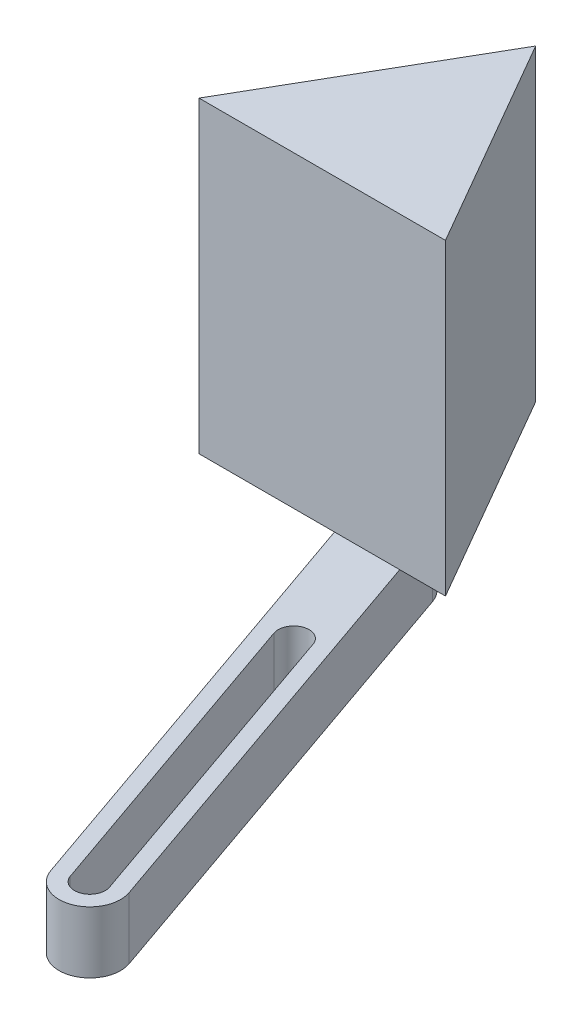
ISO-10303-21;
HEADER;
FILE_DESCRIPTION(('STEP AP214'),'2;1');
FILE_NAME('part.step','',(''),(''),'','','');
FILE_SCHEMA(('AUTOMOTIVE_DESIGN { 1 0 10303 214 1 1 1 1 }'));
ENDSEC;
DATA;
#1=APPLICATION_CONTEXT('core data for automotive mechanical design processes');
#2=APPLICATION_PROTOCOL_DEFINITION('international standard','automotive_design',2000,#1);
#3=PRODUCT_CONTEXT('',#1,'mechanical');
#4=PRODUCT('Part','Part','',(#3));
#5=PRODUCT_RELATED_PRODUCT_CATEGORY('part','',(#4));
#6=PRODUCT_DEFINITION_FORMATION('','',#4);
#7=PRODUCT_DEFINITION_CONTEXT('part definition',#1,'design');
#8=PRODUCT_DEFINITION('design','',#6,#7);
#9=PRODUCT_DEFINITION_SHAPE('','',#8);
#10=(LENGTH_UNIT() NAMED_UNIT(*) SI_UNIT(.MILLI.,.METRE.));
#11=(NAMED_UNIT(*) PLANE_ANGLE_UNIT() SI_UNIT($,.RADIAN.));
#12=(NAMED_UNIT(*) SI_UNIT($,.STERADIAN.) SOLID_ANGLE_UNIT());
#13=UNCERTAINTY_MEASURE_WITH_UNIT(LENGTH_MEASURE(1.E-05),#10,'distance_accuracy_value','');
#14=(GEOMETRIC_REPRESENTATION_CONTEXT(3) GLOBAL_UNCERTAINTY_ASSIGNED_CONTEXT((#13)) GLOBAL_UNIT_ASSIGNED_CONTEXT((#10,
#11,#12)) REPRESENTATION_CONTEXT('',''));
#15=CARTESIAN_POINT('',(0.,0.,0.));
#16=DIRECTION('',(0.,0.,1.));
#17=DIRECTION('',(1.,0.,0.));
#18=AXIS2_PLACEMENT_3D('',#15,#16,#17);
#19=CARTESIAN_POINT('',(-300.,0.,519.615242270663));
#20=DIRECTION('',(0.,-1.,0.));
#21=DIRECTION('',(0.,0.,-1.));
#22=AXIS2_PLACEMENT_3D('',#19,#20,#21);
#23=CYLINDRICAL_SURFACE('',#22,4.99999999999997);
#24=CARTESIAN_POINT('',(-300.,-10.,519.615242270663));
#25=DIRECTION('',(0.,1.,0.));
#26=DIRECTION('',(0.,0.,1.));
#27=AXIS2_PLACEMENT_3D('',#24,#25,#26);
#28=CIRCLE('',#27,4.99999999999997);
#29=CARTESIAN_POINT('',(-304.722308626151,-10.,521.258349461136));
#30=VERTEX_POINT('',#29);
#31=CARTESIAN_POINT('',(-295.277691373849,-10.,517.97213508019));
#32=VERTEX_POINT('',#31);
#33=EDGE_CURVE('E152',#30,#32,#28,.F.);
#34=ORIENTED_EDGE('',*,*,#33,.F.);
#35=DIRECTION('',(0.,-1.,0.));
#36=VECTOR('',#35,1.);
#37=CARTESIAN_POINT('',(-304.722308626151,0.,521.258349461136));
#38=LINE('',#37,#36);
#39=CARTESIAN_POINT('',(-304.722308626151,0.,521.258349461136));
#40=VERTEX_POINT('',#39);
#41=EDGE_CURVE('E11',#40,#30,#38,.T.);
#42=ORIENTED_EDGE('',*,*,#41,.F.);
#43=CARTESIAN_POINT('',(-300.,0.,519.615242270663));
#44=DIRECTION('',(0.,1.,0.));
#45=DIRECTION('',(0.,0.,1.));
#46=AXIS2_PLACEMENT_3D('',#43,#44,#45);
#47=CIRCLE('',#46,4.99999999999997);
#48=CARTESIAN_POINT('',(-295.277691373849,0.,517.97213508019));
#49=VERTEX_POINT('',#48);
#50=EDGE_CURVE('E170',#40,#49,#47,.F.);
#51=ORIENTED_EDGE('',*,*,#50,.T.);
#52=DIRECTION('',(0.,-1.,0.));
#53=VECTOR('',#52,1.);
#54=CARTESIAN_POINT('',(-295.277691373849,0.,517.97213508019));
#55=LINE('',#54,#53);
#56=EDGE_CURVE('E47',#49,#32,#55,.T.);
#57=ORIENTED_EDGE('',*,*,#56,.T.);
#58=EDGE_LOOP('',(#34,#42,#51,#57));
#59=FACE_BOUND('',#58,.T.);
#60=ADVANCED_FACE('F37',(#59),#23,.T.);
#61=CARTESIAN_POINT('',(0.,-10.,0.));
#62=DIRECTION('',(0.,1.,0.));
#63=DIRECTION('',(0.,0.,1.));
#64=AXIS2_PLACEMENT_3D('',#61,#62,#63);
#65=PLANE('',#64);
#66=ORIENTED_EDGE('',*,*,#33,.T.);
#67=DIRECTION('',(0.328621438094535,0.,0.944461725230133));
#68=VECTOR('',#67,1.);
#69=CARTESIAN_POINT('',(-424.15325169489,-10.,147.582318924024));
#70=LINE('',#69,#68);
#71=CARTESIAN_POINT('',(-268.987976326287,-10.,593.529073098601));
#72=VERTEX_POINT('',#71);
#73=EDGE_CURVE('E163',#32,#72,#70,.T.);
#74=ORIENTED_EDGE('',*,*,#73,.T.);
#75=CARTESIAN_POINT('',(-273.710284952437,-10.,595.172180289074));
#76=DIRECTION('',(0.,1.,0.));
#77=DIRECTION('',(0.,0.,1.));
#78=AXIS2_PLACEMENT_3D('',#75,#76,#77);
#79=CIRCLE('',#78,5.00000000000002);
#80=CARTESIAN_POINT('',(-278.432593578588,-10.,596.815287479546));
#81=VERTEX_POINT('',#80);
#82=EDGE_CURVE('E143',#81,#72,#79,.T.);
#83=ORIENTED_EDGE('',*,*,#82,.F.);
#84=DIRECTION('',(0.328621438094535,0.,0.944461725230133));
#85=VECTOR('',#84,1.);
#86=CARTESIAN_POINT('',(-433.597868947191,-10.,150.86853330497));
#87=LINE('',#86,#85);
#88=EDGE_CURVE('E158',#30,#81,#87,.T.);
#89=ORIENTED_EDGE('',*,*,#88,.F.);
#90=EDGE_LOOP('',(#66,#74,#83,#89));
#91=FACE_BOUND('',#90,.T.);
#92=DIRECTION('',(0.328621438094534,0.,0.944461725230134));
#93=VECTOR('',#92,1.);
#94=CARTESIAN_POINT('',(-431.236714634115,-10.,150.046979709733));
#95=LINE('',#94,#93);
#96=CARTESIAN_POINT('',(-293.72179034705,-10.,545.266425495529));
#97=VERTEX_POINT('',#96);
#98=CARTESIAN_POINT('',(-276.071439265513,-10.,595.99373388431));
#99=VERTEX_POINT('',#98);
#100=EDGE_CURVE('E98',#97,#99,#95,.T.);
#101=ORIENTED_EDGE('',*,*,#100,.T.);
#102=CARTESIAN_POINT('',(-273.710284952437,-10.,595.172180289074));
#103=DIRECTION('',(0.,1.,0.));
#104=DIRECTION('',(0.,0.,1.));
#105=AXIS2_PLACEMENT_3D('',#102,#103,#104);
#106=CIRCLE('',#105,2.50000000000002);
#107=CARTESIAN_POINT('',(-271.349130639362,-10.,594.350626693838));
#108=VERTEX_POINT('',#107);
#109=EDGE_CURVE('E133',#108,#99,#106,.F.);
#110=ORIENTED_EDGE('',*,*,#109,.F.);
#111=DIRECTION('',(0.328621438094534,0.,0.944461725230134));
#112=VECTOR('',#111,1.);
#113=CARTESIAN_POINT('',(-426.514406007964,-10.,148.40387251926));
#114=LINE('',#113,#112);
#115=CARTESIAN_POINT('',(-288.999481720899,-10.,543.623318305056));
#116=VERTEX_POINT('',#115);
#117=EDGE_CURVE('E137',#116,#108,#114,.T.);
#118=ORIENTED_EDGE('',*,*,#117,.F.);
#119=CARTESIAN_POINT('',(-291.360636033974,-10.,544.444871900293));
#120=DIRECTION('',(0.,1.,0.));
#121=DIRECTION('',(0.,0.,1.));
#122=AXIS2_PLACEMENT_3D('',#119,#120,#121);
#123=CIRCLE('',#122,2.49999999999997);
#124=EDGE_CURVE('E122',#97,#116,#123,.F.);
#125=ORIENTED_EDGE('',*,*,#124,.F.);
#126=EDGE_LOOP('',(#101,#110,#118,#125));
#127=FACE_BOUND('',#126,.T.);
#128=ADVANCED_FACE('F178',(#91,#127),#65,.F.);
#129=CARTESIAN_POINT('',(-424.15325169489,0.,147.582318924024));
#130=DIRECTION('',(0.944461725230133,0.,-0.328621438094535));
#131=DIRECTION('',(-0.328621438094535,0.,-0.944461725230133));
#132=AXIS2_PLACEMENT_3D('',#129,#130,#131);
#133=PLANE('',#132);
#134=ORIENTED_EDGE('',*,*,#73,.F.);
#135=ORIENTED_EDGE('',*,*,#56,.F.);
#136=DIRECTION('',(0.328621438094535,0.,0.944461725230133));
#137=VECTOR('',#136,1.);
#138=CARTESIAN_POINT('',(-424.15325169489,0.,147.582318924024));
#139=LINE('',#138,#137);
#140=CARTESIAN_POINT('',(-268.987976326287,0.,593.529073098601));
#141=VERTEX_POINT('',#140);
#142=EDGE_CURVE('E166',#49,#141,#139,.T.);
#143=ORIENTED_EDGE('',*,*,#142,.T.);
#144=DIRECTION('',(0.,-1.,0.));
#145=VECTOR('',#144,1.);
#146=CARTESIAN_POINT('',(-268.987976326287,0.,593.529073098601));
#147=LINE('',#146,#145);
#148=EDGE_CURVE('E147',#141,#72,#147,.T.);
#149=ORIENTED_EDGE('',*,*,#148,.T.);
#150=EDGE_LOOP('',(#134,#135,#143,#149));
#151=FACE_BOUND('',#150,.T.);
#152=ADVANCED_FACE('F180',(#151),#133,.T.);
#153=CARTESIAN_POINT('',(-433.597868947191,0.,150.86853330497));
#154=DIRECTION('',(0.944461725230133,0.,-0.328621438094535));
#155=DIRECTION('',(-0.328621438094535,0.,-0.944461725230133));
#156=AXIS2_PLACEMENT_3D('',#153,#154,#155);
#157=PLANE('',#156);
#158=ORIENTED_EDGE('',*,*,#88,.T.);
#159=DIRECTION('',(0.,-1.,0.));
#160=VECTOR('',#159,1.);
#161=CARTESIAN_POINT('',(-278.432593578588,0.,596.815287479546));
#162=LINE('',#161,#160);
#163=CARTESIAN_POINT('',(-278.432593578588,0.,596.815287479546));
#164=VERTEX_POINT('',#163);
#165=EDGE_CURVE('E41',#164,#81,#162,.T.);
#166=ORIENTED_EDGE('',*,*,#165,.F.);
#167=DIRECTION('',(0.328621438094535,0.,0.944461725230133));
#168=VECTOR('',#167,1.);
#169=CARTESIAN_POINT('',(-433.597868947191,0.,150.86853330497));
#170=LINE('',#169,#168);
#171=EDGE_CURVE('E215',#40,#164,#170,.T.);
#172=ORIENTED_EDGE('',*,*,#171,.F.);
#173=ORIENTED_EDGE('',*,*,#41,.T.);
#174=EDGE_LOOP('',(#158,#166,#172,#173));
#175=FACE_BOUND('',#174,.T.);
#176=ADVANCED_FACE('F186',(#175),#157,.F.);
#177=CARTESIAN_POINT('',(0.,0.,0.));
#178=DIRECTION('',(0.,1.,0.));
#179=DIRECTION('',(0.,0.,1.));
#180=AXIS2_PLACEMENT_3D('',#177,#178,#179);
#181=PLANE('',#180);
#182=CARTESIAN_POINT('',(-300.,0.,519.615242270663));
#183=DIRECTION('',(0.,1.,0.));
#184=DIRECTION('',(0.,0.,1.));
#185=AXIS2_PLACEMENT_3D('',#182,#183,#184);
#186=CIRCLE('',#185,2.50000000000002);
#187=CARTESIAN_POINT('',(-300.,0.,522.115242270663));
#188=VERTEX_POINT('',#187);
#189=EDGE_CURVE('E218',#188,#188,#186,.T.);
#190=ORIENTED_EDGE('',*,*,#189,.F.);
#191=EDGE_LOOP('',(#190));
#192=FACE_BOUND('',#191,.T.);
#193=ORIENTED_EDGE('',*,*,#50,.F.);
#194=ORIENTED_EDGE('',*,*,#171,.T.);
#195=CARTESIAN_POINT('',(-273.710284952437,0.,595.172180289074));
#196=DIRECTION('',(0.,1.,0.));
#197=DIRECTION('',(0.,0.,1.));
#198=AXIS2_PLACEMENT_3D('',#195,#196,#197);
#199=CIRCLE('',#198,5.00000000000002);
#200=EDGE_CURVE('E144',#164,#141,#199,.T.);
#201=ORIENTED_EDGE('',*,*,#200,.T.);
#202=ORIENTED_EDGE('',*,*,#142,.F.);
#203=EDGE_LOOP('',(#193,#194,#201,#202));
#204=FACE_BOUND('',#203,.T.);
#205=CARTESIAN_POINT('',(-273.710284952437,0.,595.172180289074));
#206=DIRECTION('',(0.,1.,0.));
#207=DIRECTION('',(0.,0.,1.));
#208=AXIS2_PLACEMENT_3D('',#205,#206,#207);
#209=CIRCLE('',#208,2.50000000000002);
#210=CARTESIAN_POINT('',(-271.349130639362,0.,594.350626693838));
#211=VERTEX_POINT('',#210);
#212=CARTESIAN_POINT('',(-276.071439265513,0.,595.99373388431));
#213=VERTEX_POINT('',#212);
#214=EDGE_CURVE('E115',#211,#213,#209,.F.);
#215=ORIENTED_EDGE('',*,*,#214,.T.);
#216=DIRECTION('',(0.328621438094534,0.,0.944461725230134));
#217=VECTOR('',#216,1.);
#218=CARTESIAN_POINT('',(-431.236714634115,0.,150.046979709733));
#219=LINE('',#218,#217);
#220=CARTESIAN_POINT('',(-293.72179034705,0.,545.266425495529));
#221=VERTEX_POINT('',#220);
#222=EDGE_CURVE('E127',#221,#213,#219,.T.);
#223=ORIENTED_EDGE('',*,*,#222,.F.);
#224=CARTESIAN_POINT('',(-291.360636033974,0.,544.444871900293));
#225=DIRECTION('',(0.,1.,0.));
#226=DIRECTION('',(0.,0.,1.));
#227=AXIS2_PLACEMENT_3D('',#224,#225,#226);
#228=CIRCLE('',#227,2.49999999999997);
#229=CARTESIAN_POINT('',(-288.999481720899,0.,543.623318305056));
#230=VERTEX_POINT('',#229);
#231=EDGE_CURVE('E114',#221,#230,#228,.F.);
#232=ORIENTED_EDGE('',*,*,#231,.T.);
#233=DIRECTION('',(0.328621438094534,0.,0.944461725230134));
#234=VECTOR('',#233,1.);
#235=CARTESIAN_POINT('',(-426.514406007964,0.,148.40387251926));
#236=LINE('',#235,#234);
#237=EDGE_CURVE('E103',#230,#211,#236,.T.);
#238=ORIENTED_EDGE('',*,*,#237,.T.);
#239=EDGE_LOOP('',(#215,#223,#232,#238));
#240=FACE_BOUND('',#239,.T.);
#241=ADVANCED_FACE('F126',(#192,#204,#240),#181,.T.);
#242=CARTESIAN_POINT('',(-291.360636033974,0.,544.444871900293));
#243=DIRECTION('',(0.,-1.,0.));
#244=DIRECTION('',(0.,0.,-1.));
#245=AXIS2_PLACEMENT_3D('',#242,#243,#244);
#246=CYLINDRICAL_SURFACE('',#245,2.49999999999997);
#247=ORIENTED_EDGE('',*,*,#124,.T.);
#248=DIRECTION('',(0.,-1.,0.));
#249=VECTOR('',#248,1.);
#250=CARTESIAN_POINT('',(-288.999481720899,0.,543.623318305056));
#251=LINE('',#250,#249);
#252=EDGE_CURVE('E107',#230,#116,#251,.T.);
#253=ORIENTED_EDGE('',*,*,#252,.F.);
#254=ORIENTED_EDGE('',*,*,#231,.F.);
#255=DIRECTION('',(0.,-1.,0.));
#256=VECTOR('',#255,1.);
#257=CARTESIAN_POINT('',(-293.72179034705,0.,545.266425495529));
#258=LINE('',#257,#256);
#259=EDGE_CURVE('E124',#221,#97,#258,.T.);
#260=ORIENTED_EDGE('',*,*,#259,.T.);
#261=EDGE_LOOP('',(#247,#253,#254,#260));
#262=FACE_BOUND('',#261,.T.);
#263=ADVANCED_FACE('F119',(#262),#246,.F.);
#264=CARTESIAN_POINT('',(-426.514406007964,0.,148.40387251926));
#265=DIRECTION('',(0.944461725230134,0.,-0.328621438094534));
#266=DIRECTION('',(-0.328621438094534,0.,-0.944461725230134));
#267=AXIS2_PLACEMENT_3D('',#264,#265,#266);
#268=PLANE('',#267);
#269=ORIENTED_EDGE('',*,*,#117,.T.);
#270=DIRECTION('',(0.,-1.,0.));
#271=VECTOR('',#270,1.);
#272=CARTESIAN_POINT('',(-271.349130639362,0.,594.350626693838));
#273=LINE('',#272,#271);
#274=EDGE_CURVE('E109',#211,#108,#273,.T.);
#275=ORIENTED_EDGE('',*,*,#274,.F.);
#276=ORIENTED_EDGE('',*,*,#237,.F.);
#277=ORIENTED_EDGE('',*,*,#252,.T.);
#278=EDGE_LOOP('',(#269,#275,#276,#277));
#279=FACE_BOUND('',#278,.T.);
#280=ADVANCED_FACE('F106',(#279),#268,.F.);
#281=CARTESIAN_POINT('',(-273.710284952437,0.,595.172180289074));
#282=DIRECTION('',(0.,-1.,0.));
#283=DIRECTION('',(0.,0.,-1.));
#284=AXIS2_PLACEMENT_3D('',#281,#282,#283);
#285=CYLINDRICAL_SURFACE('',#284,2.50000000000002);
#286=ORIENTED_EDGE('',*,*,#109,.T.);
#287=DIRECTION('',(0.,-1.,0.));
#288=VECTOR('',#287,1.);
#289=CARTESIAN_POINT('',(-276.071439265513,0.,595.99373388431));
#290=LINE('',#289,#288);
#291=EDGE_CURVE('E141',#213,#99,#290,.T.);
#292=ORIENTED_EDGE('',*,*,#291,.F.);
#293=ORIENTED_EDGE('',*,*,#214,.F.);
#294=ORIENTED_EDGE('',*,*,#274,.T.);
#295=EDGE_LOOP('',(#286,#292,#293,#294));
#296=FACE_BOUND('',#295,.T.);
#297=ADVANCED_FACE('F174',(#296),#285,.F.);
#298=CARTESIAN_POINT('',(-431.236714634115,0.,150.046979709733));
#299=DIRECTION('',(0.944461725230134,0.,-0.328621438094534));
#300=DIRECTION('',(-0.328621438094534,0.,-0.944461725230134));
#301=AXIS2_PLACEMENT_3D('',#298,#299,#300);
#302=PLANE('',#301);
#303=ORIENTED_EDGE('',*,*,#100,.F.);
#304=ORIENTED_EDGE('',*,*,#259,.F.);
#305=ORIENTED_EDGE('',*,*,#222,.T.);
#306=ORIENTED_EDGE('',*,*,#291,.T.);
#307=EDGE_LOOP('',(#303,#304,#305,#306));
#308=FACE_BOUND('',#307,.T.);
#309=ADVANCED_FACE('F176',(#308),#302,.T.);
#310=CARTESIAN_POINT('',(-273.710284952437,0.,595.172180289074));
#311=DIRECTION('',(0.,-1.,0.));
#312=DIRECTION('',(0.,0.,-1.));
#313=AXIS2_PLACEMENT_3D('',#310,#311,#312);
#314=CYLINDRICAL_SURFACE('',#313,5.00000000000002);
#315=ORIENTED_EDGE('',*,*,#82,.T.);
#316=ORIENTED_EDGE('',*,*,#148,.F.);
#317=ORIENTED_EDGE('',*,*,#200,.F.);
#318=ORIENTED_EDGE('',*,*,#165,.T.);
#319=EDGE_LOOP('',(#315,#316,#317,#318));
#320=FACE_BOUND('',#319,.T.);
#321=ADVANCED_FACE('F39',(#320),#314,.T.);
#322=CARTESIAN_POINT('',(-300.,5.,519.615242270663));
#323=DIRECTION('',(0.,-1.,0.));
#324=DIRECTION('',(0.,0.,-1.));
#325=AXIS2_PLACEMENT_3D('',#322,#323,#324);
#326=CYLINDRICAL_SURFACE('',#325,2.50000000000002);
#327=CARTESIAN_POINT('',(-300.,5.,519.615242270663));
#328=DIRECTION('',(0.,1.,0.));
#329=DIRECTION('',(0.,0.,1.));
#330=AXIS2_PLACEMENT_3D('',#327,#328,#329);
#331=CIRCLE('',#330,2.50000000000002);
#332=CARTESIAN_POINT('',(-300.,5.,522.115242270663));
#333=VERTEX_POINT('',#332);
#334=EDGE_CURVE('E134',#333,#333,#331,.T.);
#335=ORIENTED_EDGE('',*,*,#334,.F.);
#336=EDGE_LOOP('',(#335));
#337=FACE_BOUND('',#336,.T.);
#338=ORIENTED_EDGE('',*,*,#189,.T.);
#339=EDGE_LOOP('',(#338));
#340=FACE_BOUND('',#339,.T.);
#341=ADVANCED_FACE('F205',(#337,#340),#326,.T.);
#342=CARTESIAN_POINT('',(-310.,55.,513.841739578767));
#343=DIRECTION('',(-0.866025403784439,0.,-0.499999999999999));
#344=DIRECTION('',(-0.499999999999999,0.,0.866025403784439));
#345=AXIS2_PLACEMENT_3D('',#342,#343,#344);
#346=PLANE('',#345);
#347=DIRECTION('',(0.499999999999999,0.,-0.866025403784439));
#348=VECTOR('',#347,1.);
#349=CARTESIAN_POINT('',(-310.,5.,513.841739578767));
#350=LINE('',#349,#348);
#351=CARTESIAN_POINT('',(-320.,5.,531.162247654456));
#352=VERTEX_POINT('',#351);
#353=CARTESIAN_POINT('',(-300.,5.,496.521231503078));
#354=VERTEX_POINT('',#353);
#355=EDGE_CURVE('E240',#352,#354,#350,.T.);
#356=ORIENTED_EDGE('',*,*,#355,.F.);
#357=DIRECTION('',(0.,-1.,0.));
#358=VECTOR('',#357,1.);
#359=CARTESIAN_POINT('',(-320.,55.,531.162247654456));
#360=LINE('',#359,#358);
#361=CARTESIAN_POINT('',(-320.,55.,531.162247654456));
#362=VERTEX_POINT('',#361);
#363=EDGE_CURVE('E221',#362,#352,#360,.T.);
#364=ORIENTED_EDGE('',*,*,#363,.F.);
#365=DIRECTION('',(0.499999999999999,0.,-0.866025403784439));
#366=VECTOR('',#365,1.);
#367=CARTESIAN_POINT('',(-310.,55.,513.841739578767));
#368=LINE('',#367,#366);
#369=CARTESIAN_POINT('',(-300.,55.,496.521231503078));
#370=VERTEX_POINT('',#369);
#371=EDGE_CURVE('E236',#362,#370,#368,.T.);
#372=ORIENTED_EDGE('',*,*,#371,.T.);
#373=DIRECTION('',(0.,-1.,0.));
#374=VECTOR('',#373,1.);
#375=CARTESIAN_POINT('',(-300.,55.,496.521231503078));
#376=LINE('',#375,#374);
#377=EDGE_CURVE('E224',#370,#354,#376,.T.);
#378=ORIENTED_EDGE('',*,*,#377,.T.);
#379=EDGE_LOOP('',(#356,#364,#372,#378));
#380=FACE_BOUND('',#379,.T.);
#381=ADVANCED_FACE('F209',(#380),#346,.T.);
#382=CARTESIAN_POINT('',(-300.,55.,531.162247654456));
#383=DIRECTION('',(0.,0.,1.));
#384=DIRECTION('',(1.,0.,0.));
#385=AXIS2_PLACEMENT_3D('',#382,#383,#384);
#386=PLANE('',#385);
#387=DIRECTION('',(-1.,0.,0.));
#388=VECTOR('',#387,1.);
#389=CARTESIAN_POINT('',(-300.,5.,531.162247654456));
#390=LINE('',#389,#388);
#391=CARTESIAN_POINT('',(-280.,5.,531.162247654456));
#392=VERTEX_POINT('',#391);
#393=EDGE_CURVE('E233',#392,#352,#390,.T.);
#394=ORIENTED_EDGE('',*,*,#393,.F.);
#395=DIRECTION('',(0.,-1.,0.));
#396=VECTOR('',#395,1.);
#397=CARTESIAN_POINT('',(-280.,55.,531.162247654456));
#398=LINE('',#397,#396);
#399=CARTESIAN_POINT('',(-280.,55.,531.162247654456));
#400=VERTEX_POINT('',#399);
#401=EDGE_CURVE('E227',#400,#392,#398,.T.);
#402=ORIENTED_EDGE('',*,*,#401,.F.);
#403=DIRECTION('',(-1.,0.,0.));
#404=VECTOR('',#403,1.);
#405=CARTESIAN_POINT('',(-300.,55.,531.162247654456));
#406=LINE('',#405,#404);
#407=EDGE_CURVE('E228',#400,#362,#406,.T.);
#408=ORIENTED_EDGE('',*,*,#407,.T.);
#409=ORIENTED_EDGE('',*,*,#363,.T.);
#410=EDGE_LOOP('',(#394,#402,#408,#409));
#411=FACE_BOUND('',#410,.T.);
#412=ADVANCED_FACE('F268',(#411),#386,.T.);
#413=CARTESIAN_POINT('',(-290.,55.,513.841739578767));
#414=DIRECTION('',(0.86602540378444,0.,-0.499999999999997));
#415=DIRECTION('',(-0.499999999999997,0.,-0.86602540378444));
#416=AXIS2_PLACEMENT_3D('',#413,#414,#415);
#417=PLANE('',#416);
#418=DIRECTION('',(0.499999999999997,0.,0.86602540378444));
#419=VECTOR('',#418,1.);
#420=CARTESIAN_POINT('',(-290.,5.,513.841739578767));
#421=LINE('',#420,#419);
#422=EDGE_CURVE('E237',#354,#392,#421,.T.);
#423=ORIENTED_EDGE('',*,*,#422,.F.);
#424=ORIENTED_EDGE('',*,*,#377,.F.);
#425=DIRECTION('',(0.499999999999997,0.,0.86602540378444));
#426=VECTOR('',#425,1.);
#427=CARTESIAN_POINT('',(-290.,55.,513.841739578767));
#428=LINE('',#427,#426);
#429=EDGE_CURVE('E245',#370,#400,#428,.T.);
#430=ORIENTED_EDGE('',*,*,#429,.T.);
#431=ORIENTED_EDGE('',*,*,#401,.T.);
#432=EDGE_LOOP('',(#423,#424,#430,#431));
#433=FACE_BOUND('',#432,.T.);
#434=ADVANCED_FACE('F272',(#433),#417,.T.);
#435=CARTESIAN_POINT('',(0.,55.,0.));
#436=DIRECTION('',(0.,-1.,0.));
#437=DIRECTION('',(0.,0.,-1.));
#438=AXIS2_PLACEMENT_3D('',#435,#436,#437);
#439=PLANE('',#438);
#440=ORIENTED_EDGE('',*,*,#371,.F.);
#441=ORIENTED_EDGE('',*,*,#407,.F.);
#442=ORIENTED_EDGE('',*,*,#429,.F.);
#443=EDGE_LOOP('',(#440,#441,#442));
#444=FACE_BOUND('',#443,.T.);
#445=ADVANCED_FACE('F263',(#444),#439,.F.);
#446=CARTESIAN_POINT('',(0.,5.,0.));
#447=DIRECTION('',(0.,-1.,0.));
#448=DIRECTION('',(0.,0.,-1.));
#449=AXIS2_PLACEMENT_3D('',#446,#447,#448);
#450=PLANE('',#449);
#451=ORIENTED_EDGE('',*,*,#334,.T.);
#452=EDGE_LOOP('',(#451));
#453=FACE_BOUND('',#452,.T.);
#454=ORIENTED_EDGE('',*,*,#355,.T.);
#455=ORIENTED_EDGE('',*,*,#422,.T.);
#456=ORIENTED_EDGE('',*,*,#393,.T.);
#457=EDGE_LOOP('',(#454,#455,#456));
#458=FACE_BOUND('',#457,.T.);
#459=ADVANCED_FACE('F275',(#453,#458),#450,.T.);
#460=CLOSED_SHELL('',(#60,#128,#152,#176,#241,#263,#280,#297,#309,#321,#341,#381,#412,#434,#445,#459));
#461=MANIFOLD_SOLID_BREP('B2',#460);
#462=ADVANCED_BREP_SHAPE_REPRESENTATION('',(#18,#461),#14);
#463=SHAPE_DEFINITION_REPRESENTATION(#9,#462);
ENDSEC;
END-ISO-10303-21;
